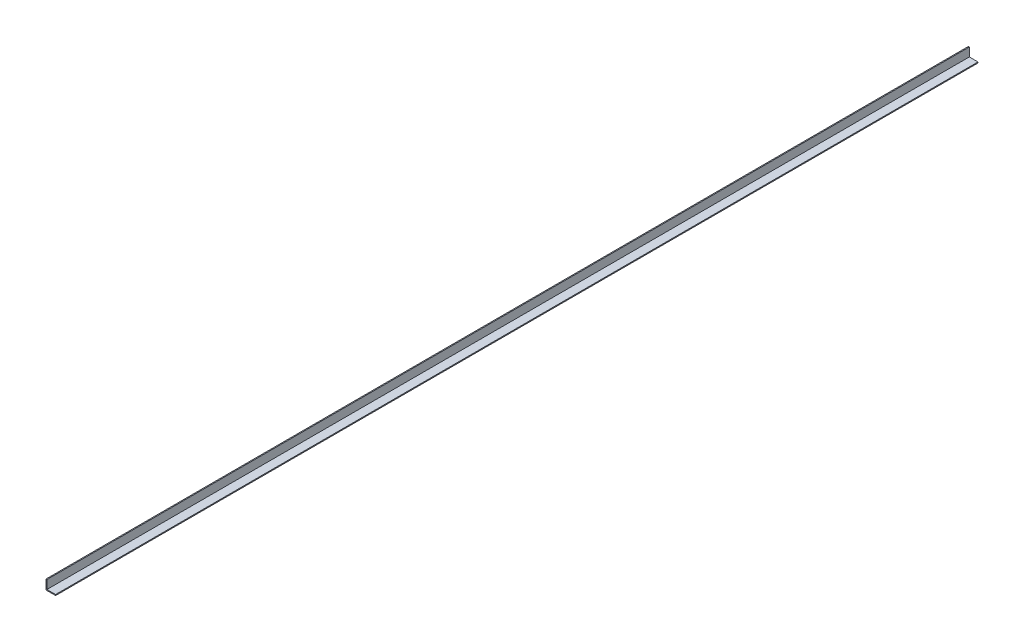
ISO-10303-21;
HEADER;
FILE_DESCRIPTION(('STEP AP214'),'2;1');
FILE_NAME('part.step','',(''),(''),'','','');
FILE_SCHEMA(('AUTOMOTIVE_DESIGN { 1 0 10303 214 1 1 1 1 }'));
ENDSEC;
DATA;
#1=APPLICATION_CONTEXT('core data for automotive mechanical design processes');
#2=APPLICATION_PROTOCOL_DEFINITION('international standard','automotive_design',2000,#1);
#3=PRODUCT_CONTEXT('',#1,'mechanical');
#4=PRODUCT('Part','Part','',(#3));
#5=PRODUCT_RELATED_PRODUCT_CATEGORY('part','',(#4));
#6=PRODUCT_DEFINITION_FORMATION('','',#4);
#7=PRODUCT_DEFINITION_CONTEXT('part definition',#1,'design');
#8=PRODUCT_DEFINITION('design','',#6,#7);
#9=PRODUCT_DEFINITION_SHAPE('','',#8);
#10=(LENGTH_UNIT() NAMED_UNIT(*) SI_UNIT(.MILLI.,.METRE.));
#11=(NAMED_UNIT(*) PLANE_ANGLE_UNIT() SI_UNIT($,.RADIAN.));
#12=(NAMED_UNIT(*) SI_UNIT($,.STERADIAN.) SOLID_ANGLE_UNIT());
#13=UNCERTAINTY_MEASURE_WITH_UNIT(LENGTH_MEASURE(1.E-05),#10,'distance_accuracy_value','');
#14=(GEOMETRIC_REPRESENTATION_CONTEXT(3) GLOBAL_UNCERTAINTY_ASSIGNED_CONTEXT((#13)) GLOBAL_UNIT_ASSIGNED_CONTEXT((#10,
#11,#12)) REPRESENTATION_CONTEXT('',''));
#15=CARTESIAN_POINT('',(0.,0.,0.));
#16=DIRECTION('',(0.,0.,1.));
#17=DIRECTION('',(1.,0.,0.));
#18=AXIS2_PLACEMENT_3D('',#15,#16,#17);
#19=CARTESIAN_POINT('',(6.35,63.5,-6100.));
#20=DIRECTION('',(0.,1.,0.));
#21=DIRECTION('',(0.,0.,1.));
#22=AXIS2_PLACEMENT_3D('',#19,#20,#21);
#23=PLANE('',#22);
#24=DIRECTION('',(-1.,0.,0.));
#25=VECTOR('',#24,1.);
#26=CARTESIAN_POINT('',(6.35,63.5,0.));
#27=LINE('',#26,#25);
#28=CARTESIAN_POINT('',(6.35,63.5,0.));
#29=VERTEX_POINT('',#28);
#30=CARTESIAN_POINT('',(0.,63.5,0.));
#31=VERTEX_POINT('',#30);
#32=EDGE_CURVE('E118',#29,#31,#27,.T.);
#33=ORIENTED_EDGE('',*,*,#32,.F.);
#34=DIRECTION('',(0.,0.,1.));
#35=VECTOR('',#34,1.);
#36=CARTESIAN_POINT('',(6.35,63.5,-6100.));
#37=LINE('',#36,#35);
#38=CARTESIAN_POINT('',(6.35,63.5,-6100.));
#39=VERTEX_POINT('',#38);
#40=EDGE_CURVE('E11',#39,#29,#37,.T.);
#41=ORIENTED_EDGE('',*,*,#40,.F.);
#42=DIRECTION('',(-1.,0.,0.));
#43=VECTOR('',#42,1.);
#44=CARTESIAN_POINT('',(6.35,63.5,-6100.));
#45=LINE('',#44,#43);
#46=CARTESIAN_POINT('',(0.,63.5,-6100.));
#47=VERTEX_POINT('',#46);
#48=EDGE_CURVE('E132',#39,#47,#45,.T.);
#49=ORIENTED_EDGE('',*,*,#48,.T.);
#50=DIRECTION('',(0.,0.,1.));
#51=VECTOR('',#50,1.);
#52=CARTESIAN_POINT('',(0.,63.5,-6100.));
#53=LINE('',#52,#51);
#54=EDGE_CURVE('E36',#47,#31,#53,.T.);
#55=ORIENTED_EDGE('',*,*,#54,.T.);
#56=EDGE_LOOP('',(#33,#41,#49,#55));
#57=FACE_BOUND('',#56,.T.);
#58=ADVANCED_FACE('F33',(#57),#23,.T.);
#59=CARTESIAN_POINT('',(6.35,6.35,-6100.));
#60=DIRECTION('',(1.,0.,0.));
#61=DIRECTION('',(0.,1.,0.));
#62=AXIS2_PLACEMENT_3D('',#59,#60,#61);
#63=PLANE('',#62);
#64=DIRECTION('',(0.,1.,0.));
#65=VECTOR('',#64,1.);
#66=CARTESIAN_POINT('',(6.35,6.35,0.));
#67=LINE('',#66,#65);
#68=CARTESIAN_POINT('',(6.35,6.35,0.));
#69=VERTEX_POINT('',#68);
#70=EDGE_CURVE('E130',#69,#29,#67,.T.);
#71=ORIENTED_EDGE('',*,*,#70,.F.);
#72=DIRECTION('',(0.,0.,1.));
#73=VECTOR('',#72,1.);
#74=CARTESIAN_POINT('',(6.35,6.35,-6100.));
#75=LINE('',#74,#73);
#76=CARTESIAN_POINT('',(6.35,6.35,-6100.));
#77=VERTEX_POINT('',#76);
#78=EDGE_CURVE('E42',#77,#69,#75,.T.);
#79=ORIENTED_EDGE('',*,*,#78,.F.);
#80=DIRECTION('',(0.,1.,0.));
#81=VECTOR('',#80,1.);
#82=CARTESIAN_POINT('',(6.35,6.35,-6100.));
#83=LINE('',#82,#81);
#84=EDGE_CURVE('E108',#77,#39,#83,.T.);
#85=ORIENTED_EDGE('',*,*,#84,.T.);
#86=ORIENTED_EDGE('',*,*,#40,.T.);
#87=EDGE_LOOP('',(#71,#79,#85,#86));
#88=FACE_BOUND('',#87,.T.);
#89=ADVANCED_FACE('F140',(#88),#63,.T.);
#90=CARTESIAN_POINT('',(63.5,6.35,-6100.));
#91=DIRECTION('',(0.,1.,0.));
#92=DIRECTION('',(-1.,0.,0.));
#93=AXIS2_PLACEMENT_3D('',#90,#91,#92);
#94=PLANE('',#93);
#95=DIRECTION('',(-1.,0.,0.));
#96=VECTOR('',#95,1.);
#97=CARTESIAN_POINT('',(63.5,6.35,0.));
#98=LINE('',#97,#96);
#99=CARTESIAN_POINT('',(63.5,6.35,0.));
#100=VERTEX_POINT('',#99);
#101=EDGE_CURVE('E95',#100,#69,#98,.T.);
#102=ORIENTED_EDGE('',*,*,#101,.F.);
#103=DIRECTION('',(0.,0.,1.));
#104=VECTOR('',#103,1.);
#105=CARTESIAN_POINT('',(63.5,6.35,-6100.));
#106=LINE('',#105,#104);
#107=CARTESIAN_POINT('',(63.5,6.35,-6100.));
#108=VERTEX_POINT('',#107);
#109=EDGE_CURVE('E90',#108,#100,#106,.T.);
#110=ORIENTED_EDGE('',*,*,#109,.F.);
#111=DIRECTION('',(-1.,0.,0.));
#112=VECTOR('',#111,1.);
#113=CARTESIAN_POINT('',(63.5,6.35,-6100.));
#114=LINE('',#113,#112);
#115=EDGE_CURVE('E93',#108,#77,#114,.T.);
#116=ORIENTED_EDGE('',*,*,#115,.T.);
#117=ORIENTED_EDGE('',*,*,#78,.T.);
#118=EDGE_LOOP('',(#102,#110,#116,#117));
#119=FACE_BOUND('',#118,.T.);
#120=ADVANCED_FACE('F92',(#119),#94,.T.);
#121=CARTESIAN_POINT('',(63.5,0.,-6100.));
#122=DIRECTION('',(1.,0.,0.));
#123=DIRECTION('',(0.,0.,-1.));
#124=AXIS2_PLACEMENT_3D('',#121,#122,#123);
#125=PLANE('',#124);
#126=DIRECTION('',(0.,1.,0.));
#127=VECTOR('',#126,1.);
#128=CARTESIAN_POINT('',(63.5,0.,0.));
#129=LINE('',#128,#127);
#130=CARTESIAN_POINT('',(63.5,0.,0.));
#131=VERTEX_POINT('',#130);
#132=EDGE_CURVE('E127',#131,#100,#129,.T.);
#133=ORIENTED_EDGE('',*,*,#132,.F.);
#134=DIRECTION('',(0.,0.,1.));
#135=VECTOR('',#134,1.);
#136=CARTESIAN_POINT('',(63.5,0.,-6100.));
#137=LINE('',#136,#135);
#138=CARTESIAN_POINT('',(63.5,0.,-6100.));
#139=VERTEX_POINT('',#138);
#140=EDGE_CURVE('E100',#139,#131,#137,.T.);
#141=ORIENTED_EDGE('',*,*,#140,.F.);
#142=DIRECTION('',(0.,1.,0.));
#143=VECTOR('',#142,1.);
#144=CARTESIAN_POINT('',(63.5,0.,-6100.));
#145=LINE('',#144,#143);
#146=EDGE_CURVE('E106',#139,#108,#145,.T.);
#147=ORIENTED_EDGE('',*,*,#146,.T.);
#148=ORIENTED_EDGE('',*,*,#109,.T.);
#149=EDGE_LOOP('',(#133,#141,#147,#148));
#150=FACE_BOUND('',#149,.T.);
#151=ADVANCED_FACE('F110',(#150),#125,.T.);
#152=CARTESIAN_POINT('',(0.,0.,-6100.));
#153=DIRECTION('',(0.,-1.,0.));
#154=DIRECTION('',(0.,0.,-1.));
#155=AXIS2_PLACEMENT_3D('',#152,#153,#154);
#156=PLANE('',#155);
#157=DIRECTION('',(1.,0.,0.));
#158=VECTOR('',#157,1.);
#159=CARTESIAN_POINT('',(0.,0.,0.));
#160=LINE('',#159,#158);
#161=CARTESIAN_POINT('',(0.,0.,0.));
#162=VERTEX_POINT('',#161);
#163=EDGE_CURVE('E124',#162,#131,#160,.T.);
#164=ORIENTED_EDGE('',*,*,#163,.F.);
#165=DIRECTION('',(0.,0.,1.));
#166=VECTOR('',#165,1.);
#167=CARTESIAN_POINT('',(0.,0.,-6100.));
#168=LINE('',#167,#166);
#169=CARTESIAN_POINT('',(0.,0.,-6100.));
#170=VERTEX_POINT('',#169);
#171=EDGE_CURVE('E135',#170,#162,#168,.T.);
#172=ORIENTED_EDGE('',*,*,#171,.F.);
#173=DIRECTION('',(1.,0.,0.));
#174=VECTOR('',#173,1.);
#175=CARTESIAN_POINT('',(0.,0.,-6100.));
#176=LINE('',#175,#174);
#177=EDGE_CURVE('E111',#170,#139,#176,.T.);
#178=ORIENTED_EDGE('',*,*,#177,.T.);
#179=ORIENTED_EDGE('',*,*,#140,.T.);
#180=EDGE_LOOP('',(#164,#172,#178,#179));
#181=FACE_BOUND('',#180,.T.);
#182=ADVANCED_FACE('F153',(#181),#156,.T.);
#183=CARTESIAN_POINT('',(0.,63.5,-6100.));
#184=DIRECTION('',(-1.,0.,0.));
#185=DIRECTION('',(0.,-1.,0.));
#186=AXIS2_PLACEMENT_3D('',#183,#184,#185);
#187=PLANE('',#186);
#188=DIRECTION('',(0.,-1.,0.));
#189=VECTOR('',#188,1.);
#190=CARTESIAN_POINT('',(0.,63.5,0.));
#191=LINE('',#190,#189);
#192=EDGE_CURVE('E121',#31,#162,#191,.T.);
#193=ORIENTED_EDGE('',*,*,#192,.F.);
#194=ORIENTED_EDGE('',*,*,#54,.F.);
#195=DIRECTION('',(0.,-1.,0.));
#196=VECTOR('',#195,1.);
#197=CARTESIAN_POINT('',(0.,63.5,-6100.));
#198=LINE('',#197,#196);
#199=EDGE_CURVE('E113',#47,#170,#198,.T.);
#200=ORIENTED_EDGE('',*,*,#199,.T.);
#201=ORIENTED_EDGE('',*,*,#171,.T.);
#202=EDGE_LOOP('',(#193,#194,#200,#201));
#203=FACE_BOUND('',#202,.T.);
#204=ADVANCED_FACE('F137',(#203),#187,.T.);
#205=CARTESIAN_POINT('',(0.,0.,-6100.));
#206=DIRECTION('',(0.,0.,1.));
#207=DIRECTION('',(1.,0.,0.));
#208=AXIS2_PLACEMENT_3D('',#205,#206,#207);
#209=PLANE('',#208);
#210=ORIENTED_EDGE('',*,*,#48,.F.);
#211=ORIENTED_EDGE('',*,*,#84,.F.);
#212=ORIENTED_EDGE('',*,*,#115,.F.);
#213=ORIENTED_EDGE('',*,*,#146,.F.);
#214=ORIENTED_EDGE('',*,*,#177,.F.);
#215=ORIENTED_EDGE('',*,*,#199,.F.);
#216=EDGE_LOOP('',(#210,#211,#212,#213,#214,#215));
#217=FACE_BOUND('',#216,.T.);
#218=ADVANCED_FACE('F104',(#217),#209,.F.);
#219=CARTESIAN_POINT('',(0.,0.,0.));
#220=DIRECTION('',(0.,0.,1.));
#221=DIRECTION('',(1.,0.,0.));
#222=AXIS2_PLACEMENT_3D('',#219,#220,#221);
#223=PLANE('',#222);
#224=ORIENTED_EDGE('',*,*,#32,.T.);
#225=ORIENTED_EDGE('',*,*,#192,.T.);
#226=ORIENTED_EDGE('',*,*,#163,.T.);
#227=ORIENTED_EDGE('',*,*,#132,.T.);
#228=ORIENTED_EDGE('',*,*,#101,.T.);
#229=ORIENTED_EDGE('',*,*,#70,.T.);
#230=EDGE_LOOP('',(#224,#225,#226,#227,#228,#229));
#231=FACE_BOUND('',#230,.T.);
#232=ADVANCED_FACE('F139',(#231),#223,.T.);
#233=CLOSED_SHELL('',(#58,#89,#120,#151,#182,#204,#218,#232));
#234=MANIFOLD_SOLID_BREP('B2',#233);
#235=ADVANCED_BREP_SHAPE_REPRESENTATION('',(#18,#234),#14);
#236=SHAPE_DEFINITION_REPRESENTATION(#9,#235);
ENDSEC;
END-ISO-10303-21;
